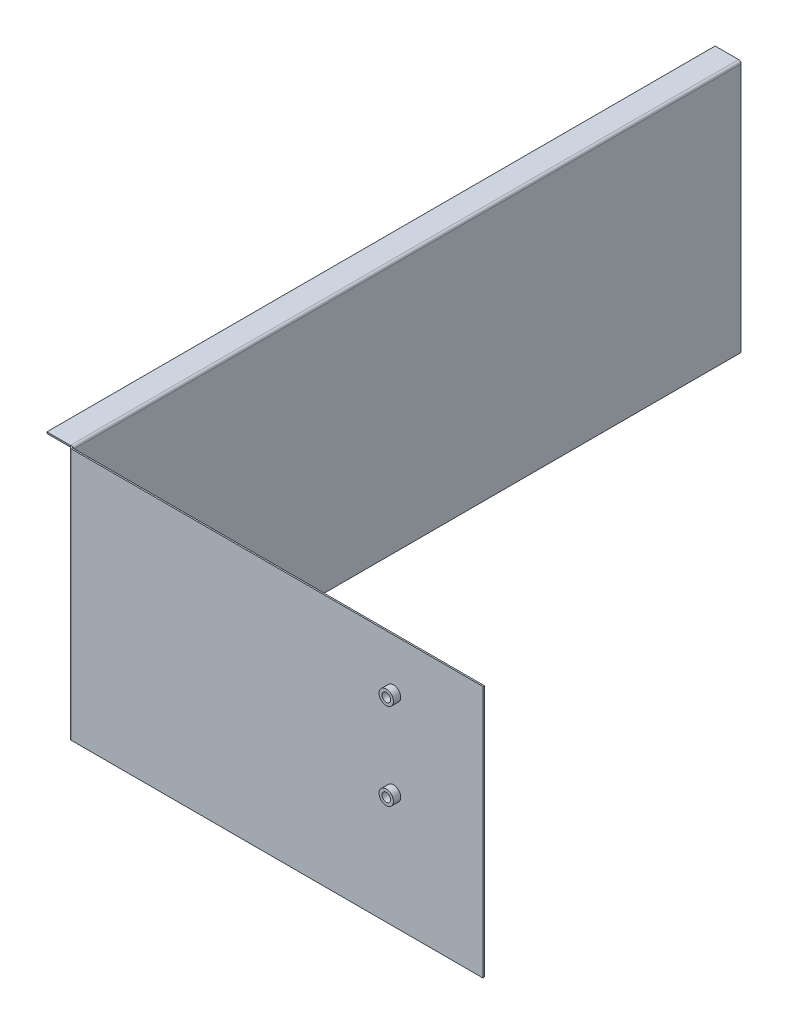
ISO-10303-21;
HEADER;
FILE_DESCRIPTION(('STEP AP214'),'2;1');
FILE_NAME('part.step','',(''),(''),'','','');
FILE_SCHEMA(('AUTOMOTIVE_DESIGN { 1 0 10303 214 1 1 1 1 }'));
ENDSEC;
DATA;
#1=APPLICATION_CONTEXT('core data for automotive mechanical design processes');
#2=APPLICATION_PROTOCOL_DEFINITION('international standard','automotive_design',2000,#1);
#3=PRODUCT_CONTEXT('',#1,'mechanical');
#4=PRODUCT('Part','Part','',(#3));
#5=PRODUCT_RELATED_PRODUCT_CATEGORY('part','',(#4));
#6=PRODUCT_DEFINITION_FORMATION('','',#4);
#7=PRODUCT_DEFINITION_CONTEXT('part definition',#1,'design');
#8=PRODUCT_DEFINITION('design','',#6,#7);
#9=PRODUCT_DEFINITION_SHAPE('','',#8);
#10=(LENGTH_UNIT() NAMED_UNIT(*) SI_UNIT(.MILLI.,.METRE.));
#11=(NAMED_UNIT(*) PLANE_ANGLE_UNIT() SI_UNIT($,.RADIAN.));
#12=(NAMED_UNIT(*) SI_UNIT($,.STERADIAN.) SOLID_ANGLE_UNIT());
#13=UNCERTAINTY_MEASURE_WITH_UNIT(LENGTH_MEASURE(1.E-05),#10,'distance_accuracy_value','');
#14=(GEOMETRIC_REPRESENTATION_CONTEXT(3) GLOBAL_UNCERTAINTY_ASSIGNED_CONTEXT((#13)) GLOBAL_UNIT_ASSIGNED_CONTEXT((#10,
#11,#12)) REPRESENTATION_CONTEXT('',''));
#15=CARTESIAN_POINT('',(0.,0.,0.));
#16=DIRECTION('',(0.,0.,1.));
#17=DIRECTION('',(1.,0.,0.));
#18=AXIS2_PLACEMENT_3D('',#15,#16,#17);
#19=CARTESIAN_POINT('',(-143.500000000001,85.7634,-1.73659999999998));
#20=DIRECTION('',(0.,0.,-1.));
#21=DIRECTION('',(0.,1.,0.));
#22=AXIS2_PLACEMENT_3D('',#19,#20,#21);
#23=PLANE('',#22);
#24=DIRECTION('',(0.,-1.,0.));
#25=VECTOR('',#24,1.);
#26=CARTESIAN_POINT('',(-142.5,-87.5,-1.7366));
#27=LINE('',#26,#25);
#28=CARTESIAN_POINT('',(-142.5,85.7634,-1.73659999999998));
#29=VERTEX_POINT('',#28);
#30=CARTESIAN_POINT('',(-142.5,87.5,-1.7366));
#31=VERTEX_POINT('',#30);
#32=EDGE_CURVE('E269',#29,#31,#27,.F.);
#33=ORIENTED_EDGE('',*,*,#32,.F.);
#34=CARTESIAN_POINT('',(-144.236600000001,85.7634,-1.73659999999998));
#35=DIRECTION('',(0.,0.,-1.));
#36=DIRECTION('',(-1.,0.,0.));
#37=AXIS2_PLACEMENT_3D('',#34,#35,#36);
#38=CIRCLE('',#37,1.73660000000002);
#39=CARTESIAN_POINT('',(-143.5,87.3360410906494,-1.7366));
#40=VERTEX_POINT('',#39);
#41=EDGE_CURVE('E228',#29,#40,#38,.F.);
#42=ORIENTED_EDGE('',*,*,#41,.T.);
#43=DIRECTION('',(4.63498613873794E-13,1.,0.));
#44=VECTOR('',#43,1.);
#45=CARTESIAN_POINT('',(-143.500000000001,85.7634,-1.73659999999998));
#46=LINE('',#45,#44);
#47=CARTESIAN_POINT('',(-143.5,87.5,-1.7366));
#48=VERTEX_POINT('',#47);
#49=EDGE_CURVE('E243',#40,#48,#46,.T.);
#50=ORIENTED_EDGE('',*,*,#49,.T.);
#51=DIRECTION('',(-1.,0.,0.));
#52=VECTOR('',#51,1.);
#53=CARTESIAN_POINT('',(-142.5,87.5,-1.7366));
#54=LINE('',#53,#52);
#55=EDGE_CURVE('E263',#31,#48,#54,.T.);
#56=ORIENTED_EDGE('',*,*,#55,.F.);
#57=EDGE_LOOP('',(#33,#42,#50,#56));
#58=FACE_BOUND('',#57,.T.);
#59=ADVANCED_FACE('F77',(#58),#23,.T.);
#60=CARTESIAN_POINT('',(-143.5,0.,5.01357118944187E-13));
#61=DIRECTION('',(-1.,0.,0.));
#62=DIRECTION('',(0.,0.,1.));
#63=AXIS2_PLACEMENT_3D('',#60,#61,#62);
#64=PLANE('',#63);
#65=CARTESIAN_POINT('',(-143.500000000001,78.4538669843767,-402.606868807182));
#66=DIRECTION('',(-1.,0.,0.));
#67=DIRECTION('',(0.,0.,1.));
#68=AXIS2_PLACEMENT_3D('',#65,#66,#67);
#69=CIRCLE('',#68,4.79400000000002);
#70=CARTESIAN_POINT('',(-143.500000000001,78.4538669843767,-397.812868807182));
#71=VERTEX_POINT('',#70);
#72=EDGE_CURVE('E397',#71,#71,#69,.T.);
#73=ORIENTED_EDGE('',*,*,#72,.F.);
#74=EDGE_LOOP('',(#73));
#75=FACE_BOUND('',#74,.T.);
#76=CARTESIAN_POINT('',(-143.500000000001,78.4538669843767,-292.599468807182));
#77=DIRECTION('',(-1.,0.,0.));
#78=DIRECTION('',(0.,0.,1.));
#79=AXIS2_PLACEMENT_3D('',#76,#77,#78);
#80=CIRCLE('',#79,4.79399999999996);
#81=CARTESIAN_POINT('',(-143.500000000001,78.4538669843767,-287.805468807182));
#82=VERTEX_POINT('',#81);
#83=EDGE_CURVE('E388',#82,#82,#80,.T.);
#84=ORIENTED_EDGE('',*,*,#83,.F.);
#85=EDGE_LOOP('',(#84));
#86=FACE_BOUND('',#85,.T.);
#87=CARTESIAN_POINT('',(-143.500000000001,78.4538669843767,-182.592068807182));
#88=DIRECTION('',(-1.,0.,0.));
#89=DIRECTION('',(0.,0.,1.));
#90=AXIS2_PLACEMENT_3D('',#87,#88,#89);
#91=CIRCLE('',#90,4.79399999999999);
#92=CARTESIAN_POINT('',(-143.500000000001,78.4538669843767,-177.798068807182));
#93=VERTEX_POINT('',#92);
#94=EDGE_CURVE('E379',#93,#93,#91,.T.);
#95=ORIENTED_EDGE('',*,*,#94,.F.);
#96=EDGE_LOOP('',(#95));
#97=FACE_BOUND('',#96,.T.);
#98=CARTESIAN_POINT('',(-143.5,78.4538669843767,-72.5846688071818));
#99=DIRECTION('',(-1.,0.,0.));
#100=DIRECTION('',(0.,0.,1.));
#101=AXIS2_PLACEMENT_3D('',#98,#99,#100);
#102=CIRCLE('',#101,4.79400000000001);
#103=CARTESIAN_POINT('',(-143.5,78.4538669843767,-67.7906688071817));
#104=VERTEX_POINT('',#103);
#105=EDGE_CURVE('E370',#104,#104,#102,.T.);
#106=ORIENTED_EDGE('',*,*,#105,.F.);
#107=EDGE_LOOP('',(#106));
#108=FACE_BOUND('',#107,.T.);
#109=DIRECTION('',(0.,1.,0.));
#110=VECTOR('',#109,1.);
#111=CARTESIAN_POINT('',(-143.5,0.,-1.7366));
#112=LINE('',#111,#110);
#113=CARTESIAN_POINT('',(-143.5,-87.5,-1.7366));
#114=VERTEX_POINT('',#113);
#115=CARTESIAN_POINT('',(-143.500000000001,85.7634,-1.73659999999998));
#116=VERTEX_POINT('',#115);
#117=EDGE_CURVE('E260',#114,#116,#112,.T.);
#118=ORIENTED_EDGE('',*,*,#117,.T.);
#119=DIRECTION('',(0.,0.,-1.));
#120=VECTOR('',#119,1.);
#121=CARTESIAN_POINT('',(-143.500000000001,85.7634,-465.));
#122=LINE('',#121,#120);
#123=CARTESIAN_POINT('',(-143.500000000001,85.7634,-465.));
#124=VERTEX_POINT('',#123);
#125=EDGE_CURVE('E236',#124,#116,#122,.F.);
#126=ORIENTED_EDGE('',*,*,#125,.F.);
#127=DIRECTION('',(0.,1.,0.));
#128=VECTOR('',#127,1.);
#129=CARTESIAN_POINT('',(-143.500000000002,87.5,-465.));
#130=LINE('',#129,#128);
#131=CARTESIAN_POINT('',(-143.500000000002,-87.4999999999999,-465.));
#132=VERTEX_POINT('',#131);
#133=EDGE_CURVE('E252',#132,#124,#130,.T.);
#134=ORIENTED_EDGE('',*,*,#133,.F.);
#135=DIRECTION('',(0.,0.,-1.));
#136=VECTOR('',#135,1.);
#137=CARTESIAN_POINT('',(-143.500000000002,-87.4999999999999,-465.));
#138=LINE('',#137,#136);
#139=EDGE_CURVE('E254',#114,#132,#138,.T.);
#140=ORIENTED_EDGE('',*,*,#139,.F.);
#141=EDGE_LOOP('',(#118,#126,#134,#140));
#142=FACE_BOUND('',#141,.T.);
#143=ADVANCED_FACE('F351',(#75,#86,#97,#108,#142),#64,.T.);
#144=CARTESIAN_POINT('',(-142.5,0.,4.97865637605344E-13));
#145=DIRECTION('',(-1.,0.,0.));
#146=DIRECTION('',(0.,0.,1.));
#147=AXIS2_PLACEMENT_3D('',#144,#145,#146);
#148=PLANE('',#147);
#149=DIRECTION('',(0.,0.,-1.));
#150=VECTOR('',#149,1.);
#151=CARTESIAN_POINT('',(-142.500000000001,85.7634,-465.));
#152=LINE('',#151,#150);
#153=CARTESIAN_POINT('',(-142.500000000002,85.7634,-465.));
#154=VERTEX_POINT('',#153);
#155=EDGE_CURVE('E223',#154,#29,#152,.F.);
#156=ORIENTED_EDGE('',*,*,#155,.T.);
#157=CARTESIAN_POINT('',(-142.5,-87.5,-1.7366));
#158=VERTEX_POINT('',#157);
#159=EDGE_CURVE('E266',#158,#29,#27,.F.);
#160=ORIENTED_EDGE('',*,*,#159,.F.);
#161=DIRECTION('',(0.,0.,1.));
#162=VECTOR('',#161,1.);
#163=CARTESIAN_POINT('',(-142.5,-87.5,4.90014518425276E-13));
#164=LINE('',#163,#162);
#165=CARTESIAN_POINT('',(-142.500000000002,-87.4999999999999,-465.));
#166=VERTEX_POINT('',#165);
#167=EDGE_CURVE('E258',#158,#166,#164,.F.);
#168=ORIENTED_EDGE('',*,*,#167,.T.);
#169=DIRECTION('',(0.,-1.,0.));
#170=VECTOR('',#169,1.);
#171=CARTESIAN_POINT('',(-142.500000000002,0.,-465.));
#172=LINE('',#171,#170);
#173=EDGE_CURVE('E256',#166,#154,#172,.F.);
#174=ORIENTED_EDGE('',*,*,#173,.T.);
#175=EDGE_LOOP('',(#156,#160,#168,#174));
#176=FACE_BOUND('',#175,.T.);
#177=ADVANCED_FACE('F448',(#176),#148,.F.);
#178=CARTESIAN_POINT('',(-143.500000000002,87.5,-465.));
#179=DIRECTION('',(0.,0.,-1.));
#180=DIRECTION('',(-1.,0.,0.));
#181=AXIS2_PLACEMENT_3D('',#178,#179,#180);
#182=PLANE('',#181);
#183=ORIENTED_EDGE('',*,*,#133,.T.);
#184=DIRECTION('',(1.,0.,0.));
#185=VECTOR('',#184,1.);
#186=CARTESIAN_POINT('',(-143.500000000001,85.7634,-465.));
#187=LINE('',#186,#185);
#188=EDGE_CURVE('E92',#124,#154,#187,.T.);
#189=ORIENTED_EDGE('',*,*,#188,.T.);
#190=ORIENTED_EDGE('',*,*,#173,.F.);
#191=DIRECTION('',(1.,0.,0.));
#192=VECTOR('',#191,1.);
#193=CARTESIAN_POINT('',(-143.500000000002,-87.4999999999999,-465.));
#194=LINE('',#193,#192);
#195=EDGE_CURVE('E248',#132,#166,#194,.T.);
#196=ORIENTED_EDGE('',*,*,#195,.F.);
#197=EDGE_LOOP('',(#183,#189,#190,#196));
#198=FACE_BOUND('',#197,.T.);
#199=ADVANCED_FACE('F459',(#198),#182,.T.);
#200=CARTESIAN_POINT('',(-143.5,87.5,-1.));
#201=DIRECTION('',(0.,1.,0.));
#202=DIRECTION('',(0.,0.,1.));
#203=AXIS2_PLACEMENT_3D('',#200,#201,#202);
#204=PLANE('',#203);
#205=DIRECTION('',(-1.,0.,0.));
#206=VECTOR('',#205,1.);
#207=CARTESIAN_POINT('',(-143.5,87.5,-1.));
#208=LINE('',#207,#206);
#209=CARTESIAN_POINT('',(143.5,87.5,-1.));
#210=VERTEX_POINT('',#209);
#211=CARTESIAN_POINT('',(-141.7634,87.5,-1.));
#212=VERTEX_POINT('',#211);
#213=EDGE_CURVE('E295',#210,#212,#208,.T.);
#214=ORIENTED_EDGE('',*,*,#213,.T.);
#215=DIRECTION('',(0.,0.,1.));
#216=VECTOR('',#215,1.);
#217=CARTESIAN_POINT('',(-141.7634,87.5,-1.));
#218=LINE('',#217,#216);
#219=CARTESIAN_POINT('',(-141.7634,87.5,0.));
#220=VERTEX_POINT('',#219);
#221=EDGE_CURVE('E278',#212,#220,#218,.T.);
#222=ORIENTED_EDGE('',*,*,#221,.T.);
#223=DIRECTION('',(-1.,0.,0.));
#224=VECTOR('',#223,1.);
#225=CARTESIAN_POINT('',(-143.5,87.5,0.));
#226=LINE('',#225,#224);
#227=CARTESIAN_POINT('',(143.5,87.5,0.));
#228=VERTEX_POINT('',#227);
#229=EDGE_CURVE('E303',#228,#220,#226,.T.);
#230=ORIENTED_EDGE('',*,*,#229,.F.);
#231=DIRECTION('',(0.,0.,1.));
#232=VECTOR('',#231,1.);
#233=CARTESIAN_POINT('',(143.5,87.5,-1.));
#234=LINE('',#233,#232);
#235=EDGE_CURVE('E300',#210,#228,#234,.T.);
#236=ORIENTED_EDGE('',*,*,#235,.F.);
#237=EDGE_LOOP('',(#214,#222,#230,#236));
#238=FACE_BOUND('',#237,.T.);
#239=ADVANCED_FACE('F463',(#238),#204,.T.);
#240=CARTESIAN_POINT('',(0.,0.,-1.));
#241=DIRECTION('',(0.,0.,-1.));
#242=DIRECTION('',(-1.,0.,0.));
#243=AXIS2_PLACEMENT_3D('',#240,#241,#242);
#244=PLANE('',#243);
#245=DIRECTION('',(1.,0.,0.));
#246=VECTOR('',#245,1.);
#247=CARTESIAN_POINT('',(-143.5,-87.5,-1.));
#248=LINE('',#247,#246);
#249=CARTESIAN_POINT('',(-141.7634,-87.5,-1.));
#250=VERTEX_POINT('',#249);
#251=CARTESIAN_POINT('',(143.5,-87.5,-1.));
#252=VERTEX_POINT('',#251);
#253=EDGE_CURVE('E298',#250,#252,#248,.T.);
#254=ORIENTED_EDGE('',*,*,#253,.F.);
#255=DIRECTION('',(0.,1.,0.));
#256=VECTOR('',#255,1.);
#257=CARTESIAN_POINT('',(-141.7634,87.5,-1.));
#258=LINE('',#257,#256);
#259=EDGE_CURVE('E100',#212,#250,#258,.F.);
#260=ORIENTED_EDGE('',*,*,#259,.F.);
#261=ORIENTED_EDGE('',*,*,#213,.F.);
#262=DIRECTION('',(0.,1.,0.));
#263=VECTOR('',#262,1.);
#264=CARTESIAN_POINT('',(143.5,-87.5,-1.));
#265=LINE('',#264,#263);
#266=EDGE_CURVE('E292',#252,#210,#265,.T.);
#267=ORIENTED_EDGE('',*,*,#266,.F.);
#268=EDGE_LOOP('',(#254,#260,#261,#267));
#269=FACE_BOUND('',#268,.T.);
#270=ADVANCED_FACE('F330',(#269),#244,.T.);
#271=CARTESIAN_POINT('',(0.,0.,0.));
#272=DIRECTION('',(0.,0.,-1.));
#273=DIRECTION('',(-1.,0.,0.));
#274=AXIS2_PLACEMENT_3D('',#271,#272,#273);
#275=PLANE('',#274);
#276=CARTESIAN_POINT('',(81.5,-7.49999999999999,0.));
#277=DIRECTION('',(0.,0.,-1.));
#278=DIRECTION('',(-1.,0.,0.));
#279=AXIS2_PLACEMENT_3D('',#276,#277,#278);
#280=CIRCLE('',#279,5.);
#281=CARTESIAN_POINT('',(76.5,-7.49999999999999,0.));
#282=VERTEX_POINT('',#281);
#283=EDGE_CURVE('E13',#282,#282,#280,.F.);
#284=ORIENTED_EDGE('',*,*,#283,.F.);
#285=EDGE_LOOP('',(#284));
#286=FACE_BOUND('',#285,.T.);
#287=CARTESIAN_POINT('',(81.5,52.5,0.));
#288=DIRECTION('',(0.,0.,-1.));
#289=DIRECTION('',(-1.,0.,0.));
#290=AXIS2_PLACEMENT_3D('',#287,#288,#289);
#291=CIRCLE('',#290,5.00000000000001);
#292=CARTESIAN_POINT('',(76.5,52.5,0.));
#293=VERTEX_POINT('',#292);
#294=EDGE_CURVE('E85',#293,#293,#291,.F.);
#295=ORIENTED_EDGE('',*,*,#294,.F.);
#296=EDGE_LOOP('',(#295));
#297=FACE_BOUND('',#296,.T.);
#298=DIRECTION('',(0.,1.,0.));
#299=VECTOR('',#298,1.);
#300=CARTESIAN_POINT('',(-141.7634,87.5,0.));
#301=LINE('',#300,#299);
#302=CARTESIAN_POINT('',(-141.7634,-87.5,0.));
#303=VERTEX_POINT('',#302);
#304=EDGE_CURVE('E272',#220,#303,#301,.F.);
#305=ORIENTED_EDGE('',*,*,#304,.T.);
#306=DIRECTION('',(1.,0.,0.));
#307=VECTOR('',#306,1.);
#308=CARTESIAN_POINT('',(-143.5,-87.5,0.));
#309=LINE('',#308,#307);
#310=CARTESIAN_POINT('',(143.5,-87.5,0.));
#311=VERTEX_POINT('',#310);
#312=EDGE_CURVE('E296',#303,#311,#309,.T.);
#313=ORIENTED_EDGE('',*,*,#312,.T.);
#314=DIRECTION('',(0.,1.,0.));
#315=VECTOR('',#314,1.);
#316=CARTESIAN_POINT('',(143.5,-87.5,0.));
#317=LINE('',#316,#315);
#318=EDGE_CURVE('E290',#311,#228,#317,.T.);
#319=ORIENTED_EDGE('',*,*,#318,.T.);
#320=ORIENTED_EDGE('',*,*,#229,.T.);
#321=EDGE_LOOP('',(#305,#313,#319,#320));
#322=FACE_BOUND('',#321,.T.);
#323=ADVANCED_FACE('F327',(#286,#297,#322),#275,.F.);
#324=CARTESIAN_POINT('',(143.5,-87.5,-1.));
#325=DIRECTION('',(1.,0.,0.));
#326=DIRECTION('',(0.,0.,-1.));
#327=AXIS2_PLACEMENT_3D('',#324,#325,#326);
#328=PLANE('',#327);
#329=ORIENTED_EDGE('',*,*,#318,.F.);
#330=DIRECTION('',(0.,0.,1.));
#331=VECTOR('',#330,1.);
#332=CARTESIAN_POINT('',(143.5,-87.5,-1.));
#333=LINE('',#332,#331);
#334=EDGE_CURVE('E307',#252,#311,#333,.T.);
#335=ORIENTED_EDGE('',*,*,#334,.F.);
#336=ORIENTED_EDGE('',*,*,#266,.T.);
#337=ORIENTED_EDGE('',*,*,#235,.T.);
#338=EDGE_LOOP('',(#329,#335,#336,#337));
#339=FACE_BOUND('',#338,.T.);
#340=ADVANCED_FACE('F79',(#339),#328,.T.);
#341=CARTESIAN_POINT('',(-143.5,-87.5,-1.));
#342=DIRECTION('',(0.,-1.,0.));
#343=DIRECTION('',(0.,0.,-1.));
#344=AXIS2_PLACEMENT_3D('',#341,#342,#343);
#345=PLANE('',#344);
#346=DIRECTION('',(0.,0.,1.));
#347=VECTOR('',#346,1.);
#348=CARTESIAN_POINT('',(-141.7634,-87.5,-1.));
#349=LINE('',#348,#347);
#350=EDGE_CURVE('E287',#250,#303,#349,.T.);
#351=ORIENTED_EDGE('',*,*,#350,.F.);
#352=ORIENTED_EDGE('',*,*,#253,.T.);
#353=ORIENTED_EDGE('',*,*,#334,.T.);
#354=ORIENTED_EDGE('',*,*,#312,.F.);
#355=EDGE_LOOP('',(#351,#352,#353,#354));
#356=FACE_BOUND('',#355,.T.);
#357=ADVANCED_FACE('F342',(#356),#345,.T.);
#358=CARTESIAN_POINT('',(-141.7634,-87.5,-1.73660000000001));
#359=DIRECTION('',(0.,-1.,0.));
#360=DIRECTION('',(0.,0.,-1.));
#361=AXIS2_PLACEMENT_3D('',#358,#359,#360);
#362=PLANE('',#361);
#363=DIRECTION('',(-1.,0.,0.));
#364=VECTOR('',#363,1.);
#365=CARTESIAN_POINT('',(-143.5,-87.5,-1.73660000000003));
#366=LINE('',#365,#364);
#367=EDGE_CURVE('E247',#158,#114,#366,.T.);
#368=ORIENTED_EDGE('',*,*,#367,.F.);
#369=CARTESIAN_POINT('',(-141.7634,-87.5,-1.73660000000001));
#370=DIRECTION('',(0.,1.,0.));
#371=DIRECTION('',(0.,0.,1.));
#372=AXIS2_PLACEMENT_3D('',#369,#370,#371);
#373=CIRCLE('',#372,0.736600000000004);
#374=EDGE_CURVE('E281',#250,#158,#373,.F.);
#375=ORIENTED_EDGE('',*,*,#374,.F.);
#376=ORIENTED_EDGE('',*,*,#350,.T.);
#377=CARTESIAN_POINT('',(-141.7634,-87.5,-1.73660000000001));
#378=DIRECTION('',(0.,1.,0.));
#379=DIRECTION('',(0.,0.,1.));
#380=AXIS2_PLACEMENT_3D('',#377,#378,#379);
#381=CIRCLE('',#380,1.7366);
#382=EDGE_CURVE('E274',#303,#114,#381,.F.);
#383=ORIENTED_EDGE('',*,*,#382,.T.);
#384=EDGE_LOOP('',(#368,#375,#376,#383));
#385=FACE_BOUND('',#384,.T.);
#386=ADVANCED_FACE('F347',(#385),#362,.T.);
#387=CARTESIAN_POINT('',(-141.7634,87.5,-1.73660000000001));
#388=DIRECTION('',(0.,-1.,0.));
#389=DIRECTION('',(0.,0.,-1.));
#390=AXIS2_PLACEMENT_3D('',#387,#388,#389);
#391=PLANE('',#390);
#392=CARTESIAN_POINT('',(-141.7634,87.5,-1.73660000000001));
#393=DIRECTION('',(0.,1.,0.));
#394=DIRECTION('',(0.,0.,1.));
#395=AXIS2_PLACEMENT_3D('',#392,#393,#394);
#396=CIRCLE('',#395,0.736600000000004);
#397=EDGE_CURVE('E251',#31,#212,#396,.T.);
#398=ORIENTED_EDGE('',*,*,#397,.F.);
#399=ORIENTED_EDGE('',*,*,#55,.T.);
#400=CARTESIAN_POINT('',(-141.7634,87.5,-1.73660000000001));
#401=DIRECTION('',(0.,1.,0.));
#402=DIRECTION('',(0.,0.,1.));
#403=AXIS2_PLACEMENT_3D('',#400,#401,#402);
#404=CIRCLE('',#403,1.7366);
#405=EDGE_CURVE('E275',#48,#220,#404,.T.);
#406=ORIENTED_EDGE('',*,*,#405,.T.);
#407=ORIENTED_EDGE('',*,*,#221,.F.);
#408=EDGE_LOOP('',(#398,#399,#406,#407));
#409=FACE_BOUND('',#408,.T.);
#410=ADVANCED_FACE('F471',(#409),#391,.F.);
#411=CARTESIAN_POINT('',(-141.7634,87.5,-1.73660000000001));
#412=DIRECTION('',(0.,1.,0.));
#413=DIRECTION('',(-1.,0.,0.));
#414=AXIS2_PLACEMENT_3D('',#411,#412,#413);
#415=CYLINDRICAL_SURFACE('',#414,1.7366);
#416=ORIENTED_EDGE('',*,*,#304,.F.);
#417=ORIENTED_EDGE('',*,*,#405,.F.);
#418=ORIENTED_EDGE('',*,*,#49,.F.);
#419=EDGE_CURVE('E244',#116,#40,#46,.T.);
#420=ORIENTED_EDGE('',*,*,#419,.F.);
#421=ORIENTED_EDGE('',*,*,#117,.F.);
#422=ORIENTED_EDGE('',*,*,#382,.F.);
#423=EDGE_LOOP('',(#416,#417,#418,#420,#421,#422));
#424=FACE_BOUND('',#423,.T.);
#425=ADVANCED_FACE('F348',(#424),#415,.T.);
#426=CARTESIAN_POINT('',(-141.7634,87.5,-1.73660000000001));
#427=DIRECTION('',(0.,1.,0.));
#428=DIRECTION('',(-1.,0.,0.));
#429=AXIS2_PLACEMENT_3D('',#426,#427,#428);
#430=CYLINDRICAL_SURFACE('',#429,0.736600000000004);
#431=ORIENTED_EDGE('',*,*,#259,.T.);
#432=ORIENTED_EDGE('',*,*,#374,.T.);
#433=ORIENTED_EDGE('',*,*,#159,.T.);
#434=ORIENTED_EDGE('',*,*,#32,.T.);
#435=ORIENTED_EDGE('',*,*,#397,.T.);
#436=EDGE_LOOP('',(#431,#432,#433,#434,#435));
#437=FACE_BOUND('',#436,.T.);
#438=ADVANCED_FACE('F467',(#437),#430,.F.);
#439=CARTESIAN_POINT('',(-143.500000000002,-87.4999999999999,-465.));
#440=DIRECTION('',(0.,-1.,0.));
#441=DIRECTION('',(0.,0.,-1.));
#442=AXIS2_PLACEMENT_3D('',#439,#440,#441);
#443=PLANE('',#442);
#444=ORIENTED_EDGE('',*,*,#167,.F.);
#445=ORIENTED_EDGE('',*,*,#367,.T.);
#446=ORIENTED_EDGE('',*,*,#139,.T.);
#447=ORIENTED_EDGE('',*,*,#195,.T.);
#448=EDGE_LOOP('',(#444,#445,#446,#447));
#449=FACE_BOUND('',#448,.T.);
#450=ADVANCED_FACE('F464',(#449),#443,.T.);
#451=CARTESIAN_POINT('',(-144.236600000001,85.7634,-1.73659999999998));
#452=DIRECTION('',(0.,0.,1.));
#453=DIRECTION('',(1.,0.,0.));
#454=AXIS2_PLACEMENT_3D('',#451,#452,#453);
#455=PLANE('',#454);
#456=CARTESIAN_POINT('',(-144.236600000001,85.7634,-1.73659999999998));
#457=DIRECTION('',(0.,0.,-1.));
#458=DIRECTION('',(-1.,0.,0.));
#459=AXIS2_PLACEMENT_3D('',#456,#457,#458);
#460=CIRCLE('',#459,0.736600000000018);
#461=CARTESIAN_POINT('',(-144.236600000001,86.5,-1.73659999999998));
#462=VERTEX_POINT('',#461);
#463=EDGE_CURVE('E233',#116,#462,#460,.F.);
#464=ORIENTED_EDGE('',*,*,#463,.F.);
#465=ORIENTED_EDGE('',*,*,#419,.T.);
#466=CARTESIAN_POINT('',(-144.236600000001,87.5,-1.73659999999998));
#467=VERTEX_POINT('',#466);
#468=EDGE_CURVE('E226',#40,#467,#38,.F.);
#469=ORIENTED_EDGE('',*,*,#468,.T.);
#470=DIRECTION('',(0.,-1.,0.));
#471=VECTOR('',#470,1.);
#472=CARTESIAN_POINT('',(-144.2366,87.5,-1.7366));
#473=LINE('',#472,#471);
#474=EDGE_CURVE('E203',#462,#467,#473,.F.);
#475=ORIENTED_EDGE('',*,*,#474,.F.);
#476=EDGE_LOOP('',(#464,#465,#469,#475));
#477=FACE_BOUND('',#476,.T.);
#478=ADVANCED_FACE('F359',(#477),#455,.T.);
#479=CARTESIAN_POINT('',(-144.236600000001,85.7634,-465.));
#480=DIRECTION('',(0.,0.,1.));
#481=DIRECTION('',(1.,0.,0.));
#482=AXIS2_PLACEMENT_3D('',#479,#480,#481);
#483=PLANE('',#482);
#484=CARTESIAN_POINT('',(-144.236600000001,85.7634,-465.));
#485=DIRECTION('',(0.,0.,-1.));
#486=DIRECTION('',(-1.,0.,0.));
#487=AXIS2_PLACEMENT_3D('',#484,#485,#486);
#488=CIRCLE('',#487,0.736600000000018);
#489=CARTESIAN_POINT('',(-144.236600000001,86.5,-465.));
#490=VERTEX_POINT('',#489);
#491=EDGE_CURVE('E239',#490,#124,#488,.T.);
#492=ORIENTED_EDGE('',*,*,#491,.F.);
#493=DIRECTION('',(0.,-1.,0.));
#494=VECTOR('',#493,1.);
#495=CARTESIAN_POINT('',(-144.236600000002,86.5,-465.));
#496=LINE('',#495,#494);
#497=CARTESIAN_POINT('',(-144.236600000002,87.5,-465.));
#498=VERTEX_POINT('',#497);
#499=EDGE_CURVE('E216',#490,#498,#496,.F.);
#500=ORIENTED_EDGE('',*,*,#499,.T.);
#501=CARTESIAN_POINT('',(-144.236600000001,85.7634,-465.));
#502=DIRECTION('',(0.,0.,-1.));
#503=DIRECTION('',(-1.,0.,0.));
#504=AXIS2_PLACEMENT_3D('',#501,#502,#503);
#505=CIRCLE('',#504,1.73660000000002);
#506=EDGE_CURVE('E227',#498,#154,#505,.T.);
#507=ORIENTED_EDGE('',*,*,#506,.T.);
#508=ORIENTED_EDGE('',*,*,#188,.F.);
#509=EDGE_LOOP('',(#492,#500,#507,#508));
#510=FACE_BOUND('',#509,.T.);
#511=ADVANCED_FACE('F454',(#510),#483,.F.);
#512=CARTESIAN_POINT('',(-144.236600000001,85.7634,-465.));
#513=DIRECTION('',(0.,0.,-1.));
#514=DIRECTION('',(0.,1.,0.));
#515=AXIS2_PLACEMENT_3D('',#512,#513,#514);
#516=CYLINDRICAL_SURFACE('',#515,1.73660000000002);
#517=ORIENTED_EDGE('',*,*,#155,.F.);
#518=ORIENTED_EDGE('',*,*,#506,.F.);
#519=DIRECTION('',(0.,0.,-1.));
#520=VECTOR('',#519,1.);
#521=CARTESIAN_POINT('',(-144.2366,87.5,-1.73659999999998));
#522=LINE('',#521,#520);
#523=EDGE_CURVE('E213',#498,#467,#522,.F.);
#524=ORIENTED_EDGE('',*,*,#523,.T.);
#525=ORIENTED_EDGE('',*,*,#468,.F.);
#526=ORIENTED_EDGE('',*,*,#41,.F.);
#527=EDGE_LOOP('',(#517,#518,#524,#525,#526));
#528=FACE_BOUND('',#527,.T.);
#529=ADVANCED_FACE('F364',(#528),#516,.T.);
#530=CARTESIAN_POINT('',(-144.236600000001,85.7634,-465.));
#531=DIRECTION('',(0.,0.,-1.));
#532=DIRECTION('',(0.,1.,0.));
#533=AXIS2_PLACEMENT_3D('',#530,#531,#532);
#534=CYLINDRICAL_SURFACE('',#533,0.736600000000018);
#535=ORIENTED_EDGE('',*,*,#125,.T.);
#536=ORIENTED_EDGE('',*,*,#463,.T.);
#537=DIRECTION('',(0.,0.,-1.));
#538=VECTOR('',#537,1.);
#539=CARTESIAN_POINT('',(-144.2366,86.5,-1.73659999999998));
#540=LINE('',#539,#538);
#541=EDGE_CURVE('E219',#462,#490,#540,.T.);
#542=ORIENTED_EDGE('',*,*,#541,.T.);
#543=ORIENTED_EDGE('',*,*,#491,.T.);
#544=EDGE_LOOP('',(#535,#536,#542,#543));
#545=FACE_BOUND('',#544,.T.);
#546=ADVANCED_FACE('F355',(#545),#534,.F.);
#547=CARTESIAN_POINT('',(-160.500000000002,87.5000000000001,-465.));
#548=DIRECTION('',(0.,0.,1.));
#549=DIRECTION('',(1.,0.,0.));
#550=AXIS2_PLACEMENT_3D('',#547,#548,#549);
#551=PLANE('',#550);
#552=ORIENTED_EDGE('',*,*,#499,.F.);
#553=DIRECTION('',(1.,0.,0.));
#554=VECTOR('',#553,1.);
#555=CARTESIAN_POINT('',(-160.500000000002,86.5,-465.));
#556=LINE('',#555,#554);
#557=CARTESIAN_POINT('',(-160.500000000002,86.5,-465.));
#558=VERTEX_POINT('',#557);
#559=EDGE_CURVE('E211',#490,#558,#556,.F.);
#560=ORIENTED_EDGE('',*,*,#559,.T.);
#561=DIRECTION('',(0.,-1.,0.));
#562=VECTOR('',#561,1.);
#563=CARTESIAN_POINT('',(-160.500000000002,87.5000000000001,-465.));
#564=LINE('',#563,#562);
#565=CARTESIAN_POINT('',(-160.500000000002,87.5000000000001,-465.));
#566=VERTEX_POINT('',#565);
#567=EDGE_CURVE('E199',#566,#558,#564,.T.);
#568=ORIENTED_EDGE('',*,*,#567,.F.);
#569=DIRECTION('',(-1.,0.,0.));
#570=VECTOR('',#569,1.);
#571=CARTESIAN_POINT('',(-1.2291826121788E-12,87.4999999999995,-465.));
#572=LINE('',#571,#570);
#573=EDGE_CURVE('E186',#498,#566,#572,.T.);
#574=ORIENTED_EDGE('',*,*,#573,.F.);
#575=EDGE_LOOP('',(#552,#560,#568,#574));
#576=FACE_BOUND('',#575,.T.);
#577=ADVANCED_FACE('F367',(#576),#551,.F.);
#578=CARTESIAN_POINT('',(-143.5,87.5,-1.7366));
#579=DIRECTION('',(0.,0.,-1.));
#580=DIRECTION('',(-1.,0.,0.));
#581=AXIS2_PLACEMENT_3D('',#578,#579,#580);
#582=PLANE('',#581);
#583=ORIENTED_EDGE('',*,*,#474,.T.);
#584=DIRECTION('',(1.,0.,0.));
#585=VECTOR('',#584,1.);
#586=CARTESIAN_POINT('',(2.85245633109136E-13,87.4999999999995,-1.73660000000033));
#587=LINE('',#586,#585);
#588=CARTESIAN_POINT('',(-160.5,87.5000000000001,-1.73659999999996));
#589=VERTEX_POINT('',#588);
#590=EDGE_CURVE('E184',#589,#467,#587,.T.);
#591=ORIENTED_EDGE('',*,*,#590,.F.);
#592=DIRECTION('',(0.,-1.,0.));
#593=VECTOR('',#592,1.);
#594=CARTESIAN_POINT('',(-160.5,87.5000000000001,-1.73659999999996));
#595=LINE('',#594,#593);
#596=CARTESIAN_POINT('',(-160.5,86.5000000000001,-1.73659999999996));
#597=VERTEX_POINT('',#596);
#598=EDGE_CURVE('E192',#589,#597,#595,.T.);
#599=ORIENTED_EDGE('',*,*,#598,.T.);
#600=DIRECTION('',(-1.,0.,0.));
#601=VECTOR('',#600,1.);
#602=CARTESIAN_POINT('',(-143.5,86.5,-1.7366));
#603=LINE('',#602,#601);
#604=EDGE_CURVE('E208',#597,#462,#603,.F.);
#605=ORIENTED_EDGE('',*,*,#604,.T.);
#606=EDGE_LOOP('',(#583,#591,#599,#605));
#607=FACE_BOUND('',#606,.T.);
#608=ADVANCED_FACE('F202',(#607),#582,.F.);
#609=CARTESIAN_POINT('',(2.89210642087963E-13,87.4999999999995,0.));
#610=DIRECTION('',(0.,-1.,0.));
#611=DIRECTION('',(1.,0.,0.));
#612=AXIS2_PLACEMENT_3D('',#609,#610,#611);
#613=PLANE('',#612);
#614=ORIENTED_EDGE('',*,*,#523,.F.);
#615=ORIENTED_EDGE('',*,*,#573,.T.);
#616=DIRECTION('',(0.,0.,1.));
#617=VECTOR('',#616,1.);
#618=CARTESIAN_POINT('',(-160.5,87.5000000000001,5.52489232992552E-13));
#619=LINE('',#618,#617);
#620=EDGE_CURVE('E179',#566,#589,#619,.T.);
#621=ORIENTED_EDGE('',*,*,#620,.T.);
#622=ORIENTED_EDGE('',*,*,#590,.T.);
#623=EDGE_LOOP('',(#614,#615,#621,#622));
#624=FACE_BOUND('',#623,.T.);
#625=ADVANCED_FACE('F182',(#624),#613,.F.);
#626=CARTESIAN_POINT('',(2.85719160749119E-13,86.4999999999995,0.));
#627=DIRECTION('',(0.,-1.,0.));
#628=DIRECTION('',(1.,0.,0.));
#629=AXIS2_PLACEMENT_3D('',#626,#627,#628);
#630=PLANE('',#629);
#631=ORIENTED_EDGE('',*,*,#559,.F.);
#632=ORIENTED_EDGE('',*,*,#541,.F.);
#633=ORIENTED_EDGE('',*,*,#604,.F.);
#634=DIRECTION('',(0.,0.,-1.));
#635=VECTOR('',#634,1.);
#636=CARTESIAN_POINT('',(-160.5,86.5000000000001,-1.73659999999996));
#637=LINE('',#636,#635);
#638=EDGE_CURVE('E195',#558,#597,#637,.F.);
#639=ORIENTED_EDGE('',*,*,#638,.F.);
#640=EDGE_LOOP('',(#631,#632,#633,#639));
#641=FACE_BOUND('',#640,.T.);
#642=ADVANCED_FACE('F510',(#641),#630,.T.);
#643=CARTESIAN_POINT('',(-160.5,87.5000000000001,-1.73659999999996));
#644=DIRECTION('',(1.,0.,0.));
#645=DIRECTION('',(0.,1.,0.));
#646=AXIS2_PLACEMENT_3D('',#643,#644,#645);
#647=PLANE('',#646);
#648=ORIENTED_EDGE('',*,*,#638,.T.);
#649=ORIENTED_EDGE('',*,*,#598,.F.);
#650=ORIENTED_EDGE('',*,*,#620,.F.);
#651=ORIENTED_EDGE('',*,*,#567,.T.);
#652=EDGE_LOOP('',(#648,#649,#650,#651));
#653=FACE_BOUND('',#652,.T.);
#654=ADVANCED_FACE('F193',(#653),#647,.F.);
#655=CARTESIAN_POINT('',(-161.5,78.4538669843767,-72.5846688071817));
#656=DIRECTION('',(-1.,0.,0.));
#657=DIRECTION('',(0.,0.,1.));
#658=AXIS2_PLACEMENT_3D('',#655,#656,#657);
#659=PLANE('',#658);
#660=CARTESIAN_POINT('',(-161.5,78.4538669843767,-72.5846688071817));
#661=DIRECTION('',(-1.,0.,0.));
#662=DIRECTION('',(0.,0.,1.));
#663=AXIS2_PLACEMENT_3D('',#660,#661,#662);
#664=CIRCLE('',#663,4.79400000000001);
#665=CARTESIAN_POINT('',(-161.5,78.4538669843767,-67.7906688071817));
#666=VERTEX_POINT('',#665);
#667=EDGE_CURVE('E222',#666,#666,#664,.T.);
#668=ORIENTED_EDGE('',*,*,#667,.T.);
#669=EDGE_LOOP('',(#668));
#670=FACE_BOUND('',#669,.T.);
#671=CARTESIAN_POINT('',(-161.5,78.4538669843767,-72.5846688071817));
#672=DIRECTION('',(-1.,0.,0.));
#673=DIRECTION('',(0.,0.,1.));
#674=AXIS2_PLACEMENT_3D('',#671,#672,#673);
#675=CIRCLE('',#674,2.794);
#676=CARTESIAN_POINT('',(-161.5,78.4538669843767,-69.7906688071817));
#677=VERTEX_POINT('',#676);
#678=EDGE_CURVE('E373',#677,#677,#675,.T.);
#679=ORIENTED_EDGE('',*,*,#678,.F.);
#680=EDGE_LOOP('',(#679));
#681=FACE_BOUND('',#680,.T.);
#682=ADVANCED_FACE('F509',(#670,#681),#659,.T.);
#683=CARTESIAN_POINT('',(-161.5,78.4538669843767,-72.5846688071817));
#684=DIRECTION('',(1.,0.,0.));
#685=DIRECTION('',(0.,0.,-1.));
#686=AXIS2_PLACEMENT_3D('',#683,#684,#685);
#687=CYLINDRICAL_SURFACE('',#686,4.79400000000001);
#688=ORIENTED_EDGE('',*,*,#667,.F.);
#689=EDGE_LOOP('',(#688));
#690=FACE_BOUND('',#689,.T.);
#691=ORIENTED_EDGE('',*,*,#105,.T.);
#692=EDGE_LOOP('',(#691));
#693=FACE_BOUND('',#692,.T.);
#694=ADVANCED_FACE('F518',(#690,#693),#687,.T.);
#695=CARTESIAN_POINT('',(-161.5,78.4538669843767,-72.5846688071817));
#696=DIRECTION('',(1.,0.,0.));
#697=DIRECTION('',(0.,0.,-1.));
#698=AXIS2_PLACEMENT_3D('',#695,#696,#697);
#699=CYLINDRICAL_SURFACE('',#698,2.794);
#700=ORIENTED_EDGE('',*,*,#678,.T.);
#701=EDGE_LOOP('',(#700));
#702=FACE_BOUND('',#701,.T.);
#703=CARTESIAN_POINT('',(-143.5,78.4538669843767,-72.5846688071818));
#704=DIRECTION('',(-1.,0.,0.));
#705=DIRECTION('',(0.,0.,1.));
#706=AXIS2_PLACEMENT_3D('',#703,#704,#705);
#707=CIRCLE('',#706,2.794);
#708=CARTESIAN_POINT('',(-143.5,78.4538669843767,-69.7906688071817));
#709=VERTEX_POINT('',#708);
#710=EDGE_CURVE('E310',#709,#709,#707,.F.);
#711=ORIENTED_EDGE('',*,*,#710,.T.);
#712=EDGE_LOOP('',(#711));
#713=FACE_BOUND('',#712,.T.);
#714=ADVANCED_FACE('F521',(#702,#713),#699,.F.);
#715=ORIENTED_EDGE('',*,*,#710,.F.);
#716=EDGE_LOOP('',(#715));
#717=FACE_BOUND('',#716,.T.);
#718=ADVANCED_FACE('F452',(#717),#64,.T.);
#719=CARTESIAN_POINT('',(-161.500000000001,78.4538669843767,-182.592068807182));
#720=DIRECTION('',(-1.,0.,0.));
#721=DIRECTION('',(0.,0.,1.));
#722=AXIS2_PLACEMENT_3D('',#719,#720,#721);
#723=PLANE('',#722);
#724=CARTESIAN_POINT('',(-161.500000000001,78.4538669843767,-182.592068807182));
#725=DIRECTION('',(-1.,0.,0.));
#726=DIRECTION('',(0.,0.,1.));
#727=AXIS2_PLACEMENT_3D('',#724,#725,#726);
#728=CIRCLE('',#727,4.79399999999999);
#729=CARTESIAN_POINT('',(-161.500000000001,78.4538669843767,-177.798068807182));
#730=VERTEX_POINT('',#729);
#731=EDGE_CURVE('E378',#730,#730,#728,.T.);
#732=ORIENTED_EDGE('',*,*,#731,.T.);
#733=EDGE_LOOP('',(#732));
#734=FACE_BOUND('',#733,.T.);
#735=CARTESIAN_POINT('',(-161.500000000001,78.4538669843767,-182.592068807182));
#736=DIRECTION('',(-1.,0.,0.));
#737=DIRECTION('',(0.,0.,1.));
#738=AXIS2_PLACEMENT_3D('',#735,#736,#737);
#739=CIRCLE('',#738,2.79399999999999);
#740=CARTESIAN_POINT('',(-161.500000000001,78.4538669843767,-179.798068807182));
#741=VERTEX_POINT('',#740);
#742=EDGE_CURVE('E382',#741,#741,#739,.T.);
#743=ORIENTED_EDGE('',*,*,#742,.F.);
#744=EDGE_LOOP('',(#743));
#745=FACE_BOUND('',#744,.T.);
#746=ADVANCED_FACE('F533',(#734,#745),#723,.T.);
#747=CARTESIAN_POINT('',(-161.500000000001,78.4538669843767,-182.592068807182));
#748=DIRECTION('',(1.,0.,0.));
#749=DIRECTION('',(0.,0.,-1.));
#750=AXIS2_PLACEMENT_3D('',#747,#748,#749);
#751=CYLINDRICAL_SURFACE('',#750,4.79399999999999);
#752=ORIENTED_EDGE('',*,*,#731,.F.);
#753=EDGE_LOOP('',(#752));
#754=FACE_BOUND('',#753,.T.);
#755=ORIENTED_EDGE('',*,*,#94,.T.);
#756=EDGE_LOOP('',(#755));
#757=FACE_BOUND('',#756,.T.);
#758=ADVANCED_FACE('F529',(#754,#757),#751,.T.);
#759=CARTESIAN_POINT('',(-161.500000000001,78.4538669843767,-182.592068807182));
#760=DIRECTION('',(1.,0.,0.));
#761=DIRECTION('',(0.,0.,-1.));
#762=AXIS2_PLACEMENT_3D('',#759,#760,#761);
#763=CYLINDRICAL_SURFACE('',#762,2.79399999999999);
#764=ORIENTED_EDGE('',*,*,#742,.T.);
#765=EDGE_LOOP('',(#764));
#766=FACE_BOUND('',#765,.T.);
#767=CARTESIAN_POINT('',(-143.500000000001,78.4538669843767,-182.592068807182));
#768=DIRECTION('',(-1.,0.,0.));
#769=DIRECTION('',(0.,0.,1.));
#770=AXIS2_PLACEMENT_3D('',#767,#768,#769);
#771=CIRCLE('',#770,2.79399999999999);
#772=CARTESIAN_POINT('',(-143.500000000001,78.4538669843767,-179.798068807182));
#773=VERTEX_POINT('',#772);
#774=EDGE_CURVE('E314',#773,#773,#771,.F.);
#775=ORIENTED_EDGE('',*,*,#774,.T.);
#776=EDGE_LOOP('',(#775));
#777=FACE_BOUND('',#776,.T.);
#778=ADVANCED_FACE('F532',(#766,#777),#763,.F.);
#779=ORIENTED_EDGE('',*,*,#774,.F.);
#780=EDGE_LOOP('',(#779));
#781=FACE_BOUND('',#780,.T.);
#782=ADVANCED_FACE('F540',(#781),#64,.T.);
#783=CARTESIAN_POINT('',(-161.500000000001,78.4538669843767,-292.599468807182));
#784=DIRECTION('',(-1.,0.,0.));
#785=DIRECTION('',(0.,0.,1.));
#786=AXIS2_PLACEMENT_3D('',#783,#784,#785);
#787=PLANE('',#786);
#788=CARTESIAN_POINT('',(-161.500000000001,78.4538669843767,-292.599468807182));
#789=DIRECTION('',(-1.,0.,0.));
#790=DIRECTION('',(0.,0.,1.));
#791=AXIS2_PLACEMENT_3D('',#788,#789,#790);
#792=CIRCLE('',#791,4.79399999999996);
#793=CARTESIAN_POINT('',(-161.500000000001,78.4538669843767,-287.805468807182));
#794=VERTEX_POINT('',#793);
#795=EDGE_CURVE('E387',#794,#794,#792,.T.);
#796=ORIENTED_EDGE('',*,*,#795,.T.);
#797=EDGE_LOOP('',(#796));
#798=FACE_BOUND('',#797,.T.);
#799=CARTESIAN_POINT('',(-161.500000000001,78.4538669843767,-292.599468807182));
#800=DIRECTION('',(-1.,0.,0.));
#801=DIRECTION('',(0.,0.,1.));
#802=AXIS2_PLACEMENT_3D('',#799,#800,#801);
#803=CIRCLE('',#802,2.79399999999998);
#804=CARTESIAN_POINT('',(-161.500000000001,78.4538669843767,-289.805468807182));
#805=VERTEX_POINT('',#804);
#806=EDGE_CURVE('E391',#805,#805,#803,.T.);
#807=ORIENTED_EDGE('',*,*,#806,.F.);
#808=EDGE_LOOP('',(#807));
#809=FACE_BOUND('',#808,.T.);
#810=ADVANCED_FACE('F546',(#798,#809),#787,.T.);
#811=CARTESIAN_POINT('',(-161.500000000001,78.4538669843767,-292.599468807182));
#812=DIRECTION('',(1.,0.,0.));
#813=DIRECTION('',(0.,0.,-1.));
#814=AXIS2_PLACEMENT_3D('',#811,#812,#813);
#815=CYLINDRICAL_SURFACE('',#814,4.79399999999996);
#816=ORIENTED_EDGE('',*,*,#795,.F.);
#817=EDGE_LOOP('',(#816));
#818=FACE_BOUND('',#817,.T.);
#819=ORIENTED_EDGE('',*,*,#83,.T.);
#820=EDGE_LOOP('',(#819));
#821=FACE_BOUND('',#820,.T.);
#822=ADVANCED_FACE('F542',(#818,#821),#815,.T.);
#823=CARTESIAN_POINT('',(-161.500000000001,78.4538669843767,-292.599468807182));
#824=DIRECTION('',(1.,0.,0.));
#825=DIRECTION('',(0.,0.,-1.));
#826=AXIS2_PLACEMENT_3D('',#823,#824,#825);
#827=CYLINDRICAL_SURFACE('',#826,2.79399999999998);
#828=ORIENTED_EDGE('',*,*,#806,.T.);
#829=EDGE_LOOP('',(#828));
#830=FACE_BOUND('',#829,.T.);
#831=CARTESIAN_POINT('',(-143.500000000001,78.4538669843767,-292.599468807182));
#832=DIRECTION('',(-1.,0.,0.));
#833=DIRECTION('',(0.,0.,1.));
#834=AXIS2_PLACEMENT_3D('',#831,#832,#833);
#835=CIRCLE('',#834,2.79399999999998);
#836=CARTESIAN_POINT('',(-143.500000000001,78.4538669843767,-289.805468807182));
#837=VERTEX_POINT('',#836);
#838=EDGE_CURVE('E317',#837,#837,#835,.F.);
#839=ORIENTED_EDGE('',*,*,#838,.T.);
#840=EDGE_LOOP('',(#839));
#841=FACE_BOUND('',#840,.T.);
#842=ADVANCED_FACE('F545',(#830,#841),#827,.F.);
#843=ORIENTED_EDGE('',*,*,#838,.F.);
#844=EDGE_LOOP('',(#843));
#845=FACE_BOUND('',#844,.T.);
#846=ADVANCED_FACE('F553',(#845),#64,.T.);
#847=CARTESIAN_POINT('',(-161.500000000001,78.4538669843767,-402.606868807182));
#848=DIRECTION('',(-1.,0.,0.));
#849=DIRECTION('',(0.,0.,1.));
#850=AXIS2_PLACEMENT_3D('',#847,#848,#849);
#851=PLANE('',#850);
#852=CARTESIAN_POINT('',(-161.500000000001,78.4538669843767,-402.606868807182));
#853=DIRECTION('',(-1.,0.,0.));
#854=DIRECTION('',(0.,0.,1.));
#855=AXIS2_PLACEMENT_3D('',#852,#853,#854);
#856=CIRCLE('',#855,4.79400000000002);
#857=CARTESIAN_POINT('',(-161.500000000001,78.4538669843767,-397.812868807182));
#858=VERTEX_POINT('',#857);
#859=EDGE_CURVE('E396',#858,#858,#856,.T.);
#860=ORIENTED_EDGE('',*,*,#859,.T.);
#861=EDGE_LOOP('',(#860));
#862=FACE_BOUND('',#861,.T.);
#863=CARTESIAN_POINT('',(-161.500000000001,78.4538669843767,-402.606868807182));
#864=DIRECTION('',(-1.,0.,0.));
#865=DIRECTION('',(0.,0.,1.));
#866=AXIS2_PLACEMENT_3D('',#863,#864,#865);
#867=CIRCLE('',#866,2.79400000000003);
#868=CARTESIAN_POINT('',(-161.500000000001,78.4538669843767,-399.812868807182));
#869=VERTEX_POINT('',#868);
#870=EDGE_CURVE('E400',#869,#869,#867,.T.);
#871=ORIENTED_EDGE('',*,*,#870,.F.);
#872=EDGE_LOOP('',(#871));
#873=FACE_BOUND('',#872,.T.);
#874=ADVANCED_FACE('F559',(#862,#873),#851,.T.);
#875=CARTESIAN_POINT('',(-161.500000000001,78.4538669843767,-402.606868807182));
#876=DIRECTION('',(1.,0.,0.));
#877=DIRECTION('',(0.,0.,-1.));
#878=AXIS2_PLACEMENT_3D('',#875,#876,#877);
#879=CYLINDRICAL_SURFACE('',#878,4.79400000000002);
#880=ORIENTED_EDGE('',*,*,#859,.F.);
#881=EDGE_LOOP('',(#880));
#882=FACE_BOUND('',#881,.T.);
#883=ORIENTED_EDGE('',*,*,#72,.T.);
#884=EDGE_LOOP('',(#883));
#885=FACE_BOUND('',#884,.T.);
#886=ADVANCED_FACE('F555',(#882,#885),#879,.T.);
#887=CARTESIAN_POINT('',(-161.500000000001,78.4538669843767,-402.606868807182));
#888=DIRECTION('',(1.,0.,0.));
#889=DIRECTION('',(0.,0.,-1.));
#890=AXIS2_PLACEMENT_3D('',#887,#888,#889);
#891=CYLINDRICAL_SURFACE('',#890,2.79400000000003);
#892=ORIENTED_EDGE('',*,*,#870,.T.);
#893=EDGE_LOOP('',(#892));
#894=FACE_BOUND('',#893,.T.);
#895=CARTESIAN_POINT('',(-143.500000000001,78.4538669843767,-402.606868807182));
#896=DIRECTION('',(-1.,0.,0.));
#897=DIRECTION('',(0.,0.,1.));
#898=AXIS2_PLACEMENT_3D('',#895,#896,#897);
#899=CIRCLE('',#898,2.79400000000003);
#900=CARTESIAN_POINT('',(-143.500000000001,78.4538669843767,-399.812868807182));
#901=VERTEX_POINT('',#900);
#902=EDGE_CURVE('E320',#901,#901,#899,.F.);
#903=ORIENTED_EDGE('',*,*,#902,.T.);
#904=EDGE_LOOP('',(#903));
#905=FACE_BOUND('',#904,.T.);
#906=ADVANCED_FACE('F558',(#894,#905),#891,.F.);
#907=ORIENTED_EDGE('',*,*,#902,.F.);
#908=EDGE_LOOP('',(#907));
#909=FACE_BOUND('',#908,.T.);
#910=ADVANCED_FACE('F451',(#909),#64,.T.);
#911=CARTESIAN_POINT('',(81.5,52.5,5.));
#912=DIRECTION('',(0.,0.,1.));
#913=DIRECTION('',(1.,0.,0.));
#914=AXIS2_PLACEMENT_3D('',#911,#912,#913);
#915=PLANE('',#914);
#916=CARTESIAN_POINT('',(81.5,52.5,5.));
#917=DIRECTION('',(0.,0.,1.));
#918=DIRECTION('',(1.,0.,0.));
#919=AXIS2_PLACEMENT_3D('',#916,#917,#918);
#920=CIRCLE('',#919,5.00000000000001);
#921=CARTESIAN_POINT('',(86.5,52.5,5.));
#922=VERTEX_POINT('',#921);
#923=EDGE_CURVE('E405',#922,#922,#920,.T.);
#924=ORIENTED_EDGE('',*,*,#923,.T.);
#925=EDGE_LOOP('',(#924));
#926=FACE_BOUND('',#925,.T.);
#927=CARTESIAN_POINT('',(81.5,52.5,5.));
#928=DIRECTION('',(0.,0.,1.));
#929=DIRECTION('',(1.,0.,0.));
#930=AXIS2_PLACEMENT_3D('',#927,#928,#929);
#931=CIRCLE('',#930,3.00000000000001);
#932=CARTESIAN_POINT('',(84.5,52.5,5.));
#933=VERTEX_POINT('',#932);
#934=EDGE_CURVE('E408',#933,#933,#931,.T.);
#935=ORIENTED_EDGE('',*,*,#934,.F.);
#936=EDGE_LOOP('',(#935));
#937=FACE_BOUND('',#936,.T.);
#938=ADVANCED_FACE('F569',(#926,#937),#915,.T.);
#939=CARTESIAN_POINT('',(81.5,52.5,5.));
#940=DIRECTION('',(0.,0.,-1.));
#941=DIRECTION('',(-1.,0.,0.));
#942=AXIS2_PLACEMENT_3D('',#939,#940,#941);
#943=CYLINDRICAL_SURFACE('',#942,5.00000000000001);
#944=ORIENTED_EDGE('',*,*,#923,.F.);
#945=EDGE_LOOP('',(#944));
#946=FACE_BOUND('',#945,.T.);
#947=ORIENTED_EDGE('',*,*,#294,.T.);
#948=EDGE_LOOP('',(#947));
#949=FACE_BOUND('',#948,.T.);
#950=ADVANCED_FACE('F325',(#946,#949),#943,.T.);
#951=CARTESIAN_POINT('',(81.5,52.5,5.));
#952=DIRECTION('',(0.,0.,-1.));
#953=DIRECTION('',(-1.,0.,0.));
#954=AXIS2_PLACEMENT_3D('',#951,#952,#953);
#955=CYLINDRICAL_SURFACE('',#954,3.00000000000001);
#956=ORIENTED_EDGE('',*,*,#934,.T.);
#957=EDGE_LOOP('',(#956));
#958=FACE_BOUND('',#957,.T.);
#959=CARTESIAN_POINT('',(81.5,52.5,0.));
#960=DIRECTION('',(0.,0.,1.));
#961=DIRECTION('',(1.,0.,0.));
#962=AXIS2_PLACEMENT_3D('',#959,#960,#961);
#963=CIRCLE('',#962,3.00000000000001);
#964=CARTESIAN_POINT('',(84.5,52.5,0.));
#965=VERTEX_POINT('',#964);
#966=EDGE_CURVE('E409',#965,#965,#963,.T.);
#967=ORIENTED_EDGE('',*,*,#966,.F.);
#968=EDGE_LOOP('',(#967));
#969=FACE_BOUND('',#968,.T.);
#970=ADVANCED_FACE('F439',(#958,#969),#955,.F.);
#971=ORIENTED_EDGE('',*,*,#966,.T.);
#972=EDGE_LOOP('',(#971));
#973=FACE_BOUND('',#972,.T.);
#974=ADVANCED_FACE('F334',(#973),#275,.F.);
#975=CARTESIAN_POINT('',(81.5,-7.49999999999999,5.));
#976=DIRECTION('',(0.,0.,1.));
#977=DIRECTION('',(1.,0.,0.));
#978=AXIS2_PLACEMENT_3D('',#975,#976,#977);
#979=PLANE('',#978);
#980=CARTESIAN_POINT('',(81.5,-7.49999999999999,5.));
#981=DIRECTION('',(0.,0.,1.));
#982=DIRECTION('',(1.,0.,0.));
#983=AXIS2_PLACEMENT_3D('',#980,#981,#982);
#984=CIRCLE('',#983,5.);
#985=CARTESIAN_POINT('',(86.5,-7.49999999999999,5.));
#986=VERTEX_POINT('',#985);
#987=EDGE_CURVE('E412',#986,#986,#984,.T.);
#988=ORIENTED_EDGE('',*,*,#987,.T.);
#989=EDGE_LOOP('',(#988));
#990=FACE_BOUND('',#989,.T.);
#991=CARTESIAN_POINT('',(81.5,-7.49999999999999,5.));
#992=DIRECTION('',(0.,0.,1.));
#993=DIRECTION('',(1.,0.,0.));
#994=AXIS2_PLACEMENT_3D('',#991,#992,#993);
#995=CIRCLE('',#994,3.00000000000001);
#996=CARTESIAN_POINT('',(84.5,-7.49999999999999,5.));
#997=VERTEX_POINT('',#996);
#998=EDGE_CURVE('E417',#997,#997,#995,.T.);
#999=ORIENTED_EDGE('',*,*,#998,.F.);
#1000=EDGE_LOOP('',(#999));
#1001=FACE_BOUND('',#1000,.T.);
#1002=ADVANCED_FACE('F427',(#990,#1001),#979,.T.);
#1003=CARTESIAN_POINT('',(81.5,-7.49999999999999,5.));
#1004=DIRECTION('',(0.,0.,-1.));
#1005=DIRECTION('',(-1.,0.,0.));
#1006=AXIS2_PLACEMENT_3D('',#1003,#1004,#1005);
#1007=CYLINDRICAL_SURFACE('',#1006,5.);
#1008=ORIENTED_EDGE('',*,*,#987,.F.);
#1009=EDGE_LOOP('',(#1008));
#1010=FACE_BOUND('',#1009,.T.);
#1011=ORIENTED_EDGE('',*,*,#283,.T.);
#1012=EDGE_LOOP('',(#1011));
#1013=FACE_BOUND('',#1012,.T.);
#1014=ADVANCED_FACE('F429',(#1010,#1013),#1007,.T.);
#1015=CARTESIAN_POINT('',(81.5,-7.49999999999999,5.));
#1016=DIRECTION('',(0.,0.,-1.));
#1017=DIRECTION('',(-1.,0.,0.));
#1018=AXIS2_PLACEMENT_3D('',#1015,#1016,#1017);
#1019=CYLINDRICAL_SURFACE('',#1018,3.00000000000001);
#1020=ORIENTED_EDGE('',*,*,#998,.T.);
#1021=EDGE_LOOP('',(#1020));
#1022=FACE_BOUND('',#1021,.T.);
#1023=CARTESIAN_POINT('',(81.5,-7.49999999999999,0.));
#1024=DIRECTION('',(0.,0.,1.));
#1025=DIRECTION('',(1.,0.,0.));
#1026=AXIS2_PLACEMENT_3D('',#1023,#1024,#1025);
#1027=CIRCLE('',#1026,3.00000000000001);
#1028=CARTESIAN_POINT('',(84.5,-7.49999999999999,0.));
#1029=VERTEX_POINT('',#1028);
#1030=EDGE_CURVE('E418',#1029,#1029,#1027,.T.);
#1031=ORIENTED_EDGE('',*,*,#1030,.F.);
#1032=EDGE_LOOP('',(#1031));
#1033=FACE_BOUND('',#1032,.T.);
#1034=ADVANCED_FACE('F424',(#1022,#1033),#1019,.F.);
#1035=ORIENTED_EDGE('',*,*,#1030,.T.);
#1036=EDGE_LOOP('',(#1035));
#1037=FACE_BOUND('',#1036,.T.);
#1038=ADVANCED_FACE('F333',(#1037),#275,.F.);
#1039=CLOSED_SHELL('',(#59,#143,#177,#199,#239,#270,#323,#340,#357,#386,#410,#425,#438,#450,
#478,#511,#529,#546,#577,#608,#625,#642,#654,#682,#694,#714,#718,#746,#758,#778,#782,#810,#822,
#842,#846,#874,#886,#906,#910,#938,#950,#970,#974,#1002,#1014,#1034,#1038));
#1040=MANIFOLD_SOLID_BREP('B2',#1039);
#1041=ADVANCED_BREP_SHAPE_REPRESENTATION('',(#18,#1040),#14);
#1042=SHAPE_DEFINITION_REPRESENTATION(#9,#1041);
ENDSEC;
END-ISO-10303-21;
